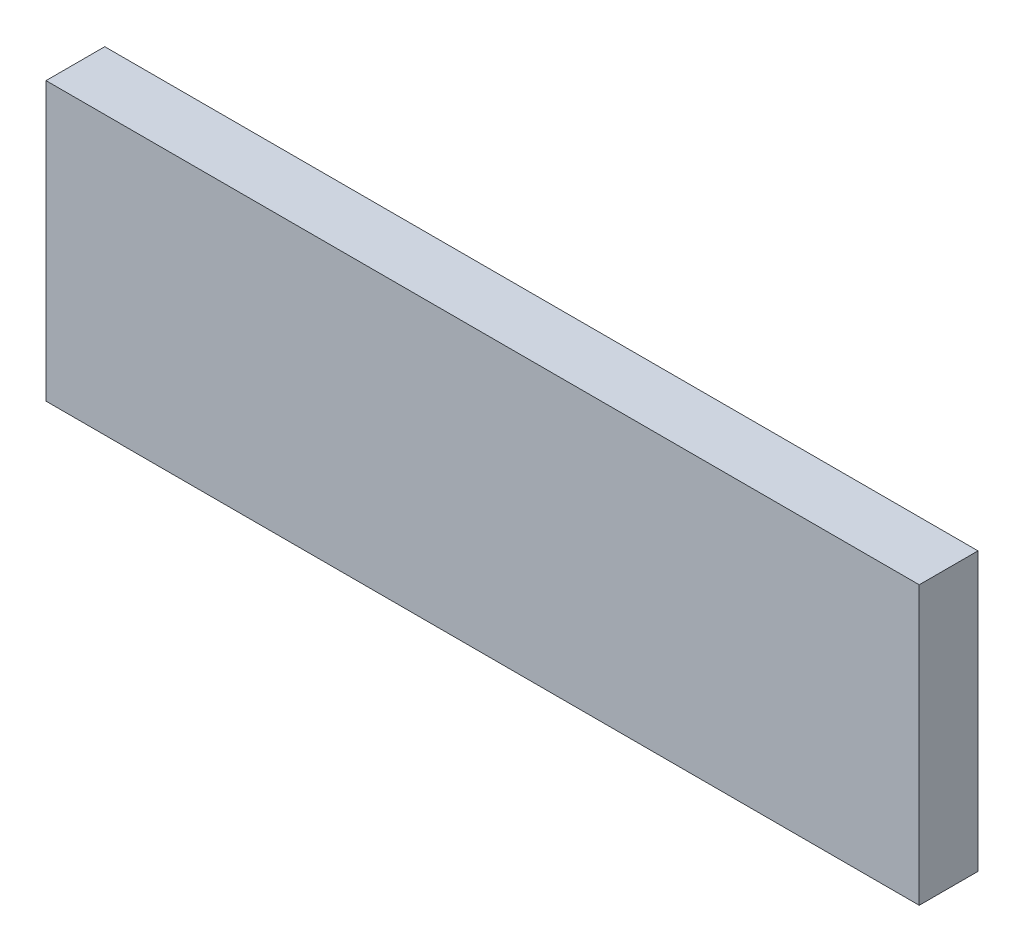
ISO-10303-21;
HEADER;
FILE_DESCRIPTION(('STEP AP214'),'2;1');
FILE_NAME('part.step','',(''),(''),'','','');
FILE_SCHEMA(('AUTOMOTIVE_DESIGN { 1 0 10303 214 1 1 1 1 }'));
ENDSEC;
DATA;
#1=APPLICATION_CONTEXT('core data for automotive mechanical design processes');
#2=APPLICATION_PROTOCOL_DEFINITION('international standard','automotive_design',2000,#1);
#3=PRODUCT_CONTEXT('',#1,'mechanical');
#4=PRODUCT('Part','Part','',(#3));
#5=PRODUCT_RELATED_PRODUCT_CATEGORY('part','',(#4));
#6=PRODUCT_DEFINITION_FORMATION('','',#4);
#7=PRODUCT_DEFINITION_CONTEXT('part definition',#1,'design');
#8=PRODUCT_DEFINITION('design','',#6,#7);
#9=PRODUCT_DEFINITION_SHAPE('','',#8);
#10=(LENGTH_UNIT() NAMED_UNIT(*) SI_UNIT(.MILLI.,.METRE.));
#11=(NAMED_UNIT(*) PLANE_ANGLE_UNIT() SI_UNIT($,.RADIAN.));
#12=(NAMED_UNIT(*) SI_UNIT($,.STERADIAN.) SOLID_ANGLE_UNIT());
#13=UNCERTAINTY_MEASURE_WITH_UNIT(LENGTH_MEASURE(1.E-05),#10,'distance_accuracy_value','');
#14=(GEOMETRIC_REPRESENTATION_CONTEXT(3) GLOBAL_UNCERTAINTY_ASSIGNED_CONTEXT((#13)) GLOBAL_UNIT_ASSIGNED_CONTEXT((#10,
#11,#12)) REPRESENTATION_CONTEXT('',''));
#15=CARTESIAN_POINT('',(0.,0.,0.));
#16=DIRECTION('',(0.,0.,1.));
#17=DIRECTION('',(1.,0.,0.));
#18=AXIS2_PLACEMENT_3D('',#15,#16,#17);
#19=CARTESIAN_POINT('',(-141.55,90.,19.05));
#20=DIRECTION('',(1.,0.,0.));
#21=DIRECTION('',(0.,0.,-1.));
#22=AXIS2_PLACEMENT_3D('',#19,#20,#21);
#23=PLANE('',#22);
#24=DIRECTION('',(0.,-1.,0.));
#25=VECTOR('',#24,1.);
#26=CARTESIAN_POINT('',(-141.55,90.,0.));
#27=LINE('',#26,#25);
#28=CARTESIAN_POINT('',(-141.55,90.,0.));
#29=VERTEX_POINT('',#28);
#30=CARTESIAN_POINT('',(-141.55,0.,0.));
#31=VERTEX_POINT('',#30);
#32=EDGE_CURVE('E96',#29,#31,#27,.T.);
#33=ORIENTED_EDGE('',*,*,#32,.T.);
#34=DIRECTION('',(0.,0.,-1.));
#35=VECTOR('',#34,1.);
#36=CARTESIAN_POINT('',(-141.55,0.,19.05));
#37=LINE('',#36,#35);
#38=CARTESIAN_POINT('',(-141.55,0.,19.05));
#39=VERTEX_POINT('',#38);
#40=EDGE_CURVE('E11',#39,#31,#37,.T.);
#41=ORIENTED_EDGE('',*,*,#40,.F.);
#42=DIRECTION('',(0.,-1.,0.));
#43=VECTOR('',#42,1.);
#44=CARTESIAN_POINT('',(-141.55,90.,19.05));
#45=LINE('',#44,#43);
#46=CARTESIAN_POINT('',(-141.55,90.,19.05));
#47=VERTEX_POINT('',#46);
#48=EDGE_CURVE('E84',#47,#39,#45,.T.);
#49=ORIENTED_EDGE('',*,*,#48,.F.);
#50=DIRECTION('',(0.,0.,-1.));
#51=VECTOR('',#50,1.);
#52=CARTESIAN_POINT('',(-141.55,90.,19.05));
#53=LINE('',#52,#51);
#54=EDGE_CURVE('E92',#47,#29,#53,.T.);
#55=ORIENTED_EDGE('',*,*,#54,.T.);
#56=EDGE_LOOP('',(#33,#41,#49,#55));
#57=FACE_BOUND('',#56,.T.);
#58=ADVANCED_FACE('F33',(#57),#23,.F.);
#59=CARTESIAN_POINT('',(-141.55,0.,19.05));
#60=DIRECTION('',(0.,1.,0.));
#61=DIRECTION('',(0.,0.,1.));
#62=AXIS2_PLACEMENT_3D('',#59,#60,#61);
#63=PLANE('',#62);
#64=DIRECTION('',(1.,0.,0.));
#65=VECTOR('',#64,1.);
#66=CARTESIAN_POINT('',(-141.55,0.,0.));
#67=LINE('',#66,#65);
#68=CARTESIAN_POINT('',(141.55,0.,0.));
#69=VERTEX_POINT('',#68);
#70=EDGE_CURVE('E88',#31,#69,#67,.T.);
#71=ORIENTED_EDGE('',*,*,#70,.T.);
#72=DIRECTION('',(0.,0.,-1.));
#73=VECTOR('',#72,1.);
#74=CARTESIAN_POINT('',(141.55,0.,19.05));
#75=LINE('',#74,#73);
#76=CARTESIAN_POINT('',(141.55,0.,19.05));
#77=VERTEX_POINT('',#76);
#78=EDGE_CURVE('E41',#77,#69,#75,.T.);
#79=ORIENTED_EDGE('',*,*,#78,.F.);
#80=DIRECTION('',(1.,0.,0.));
#81=VECTOR('',#80,1.);
#82=CARTESIAN_POINT('',(-141.55,0.,19.05));
#83=LINE('',#82,#81);
#84=EDGE_CURVE('E79',#39,#77,#83,.T.);
#85=ORIENTED_EDGE('',*,*,#84,.F.);
#86=ORIENTED_EDGE('',*,*,#40,.T.);
#87=EDGE_LOOP('',(#71,#79,#85,#86));
#88=FACE_BOUND('',#87,.T.);
#89=ADVANCED_FACE('F87',(#88),#63,.F.);
#90=CARTESIAN_POINT('',(141.55,90.,19.05));
#91=DIRECTION('',(-1.,0.,0.));
#92=DIRECTION('',(0.,0.,1.));
#93=AXIS2_PLACEMENT_3D('',#90,#91,#92);
#94=PLANE('',#93);
#95=DIRECTION('',(0.,1.,0.));
#96=VECTOR('',#95,1.);
#97=CARTESIAN_POINT('',(141.55,90.,0.));
#98=LINE('',#97,#96);
#99=CARTESIAN_POINT('',(141.55,90.,0.));
#100=VERTEX_POINT('',#99);
#101=EDGE_CURVE('E66',#69,#100,#98,.T.);
#102=ORIENTED_EDGE('',*,*,#101,.T.);
#103=DIRECTION('',(0.,0.,-1.));
#104=VECTOR('',#103,1.);
#105=CARTESIAN_POINT('',(141.55,90.,19.05));
#106=LINE('',#105,#104);
#107=CARTESIAN_POINT('',(141.55,90.,19.05));
#108=VERTEX_POINT('',#107);
#109=EDGE_CURVE('E89',#108,#100,#106,.T.);
#110=ORIENTED_EDGE('',*,*,#109,.F.);
#111=DIRECTION('',(0.,1.,0.));
#112=VECTOR('',#111,1.);
#113=CARTESIAN_POINT('',(141.55,90.,19.05));
#114=LINE('',#113,#112);
#115=EDGE_CURVE('E82',#77,#108,#114,.T.);
#116=ORIENTED_EDGE('',*,*,#115,.F.);
#117=ORIENTED_EDGE('',*,*,#78,.T.);
#118=EDGE_LOOP('',(#102,#110,#116,#117));
#119=FACE_BOUND('',#118,.T.);
#120=ADVANCED_FACE('F90',(#119),#94,.F.);
#121=CARTESIAN_POINT('',(-141.55,90.,19.05));
#122=DIRECTION('',(0.,-1.,0.));
#123=DIRECTION('',(0.,0.,-1.));
#124=AXIS2_PLACEMENT_3D('',#121,#122,#123);
#125=PLANE('',#124);
#126=DIRECTION('',(-1.,0.,0.));
#127=VECTOR('',#126,1.);
#128=CARTESIAN_POINT('',(-141.55,90.,0.));
#129=LINE('',#128,#127);
#130=EDGE_CURVE('E72',#100,#29,#129,.T.);
#131=ORIENTED_EDGE('',*,*,#130,.T.);
#132=ORIENTED_EDGE('',*,*,#54,.F.);
#133=DIRECTION('',(-1.,0.,0.));
#134=VECTOR('',#133,1.);
#135=CARTESIAN_POINT('',(-141.55,90.,19.05));
#136=LINE('',#135,#134);
#137=EDGE_CURVE('E49',#108,#47,#136,.T.);
#138=ORIENTED_EDGE('',*,*,#137,.F.);
#139=ORIENTED_EDGE('',*,*,#109,.T.);
#140=EDGE_LOOP('',(#131,#132,#138,#139));
#141=FACE_BOUND('',#140,.T.);
#142=ADVANCED_FACE('F103',(#141),#125,.F.);
#143=CARTESIAN_POINT('',(0.,0.,19.05));
#144=DIRECTION('',(0.,0.,1.));
#145=DIRECTION('',(1.,0.,0.));
#146=AXIS2_PLACEMENT_3D('',#143,#144,#145);
#147=PLANE('',#146);
#148=ORIENTED_EDGE('',*,*,#48,.T.);
#149=ORIENTED_EDGE('',*,*,#84,.T.);
#150=ORIENTED_EDGE('',*,*,#115,.T.);
#151=ORIENTED_EDGE('',*,*,#137,.T.);
#152=EDGE_LOOP('',(#148,#149,#150,#151));
#153=FACE_BOUND('',#152,.T.);
#154=ADVANCED_FACE('F80',(#153),#147,.T.);
#155=CARTESIAN_POINT('',(0.,0.,0.));
#156=DIRECTION('',(0.,0.,1.));
#157=DIRECTION('',(1.,0.,0.));
#158=AXIS2_PLACEMENT_3D('',#155,#156,#157);
#159=PLANE('',#158);
#160=ORIENTED_EDGE('',*,*,#32,.F.);
#161=ORIENTED_EDGE('',*,*,#130,.F.);
#162=ORIENTED_EDGE('',*,*,#101,.F.);
#163=ORIENTED_EDGE('',*,*,#70,.F.);
#164=EDGE_LOOP('',(#160,#161,#162,#163));
#165=FACE_BOUND('',#164,.T.);
#166=ADVANCED_FACE('F106',(#165),#159,.F.);
#167=CLOSED_SHELL('',(#58,#89,#120,#142,#154,#166));
#168=MANIFOLD_SOLID_BREP('B2',#167);
#169=ADVANCED_BREP_SHAPE_REPRESENTATION('',(#18,#168),#14);
#170=SHAPE_DEFINITION_REPRESENTATION(#9,#169);
ENDSEC;
END-ISO-10303-21;
